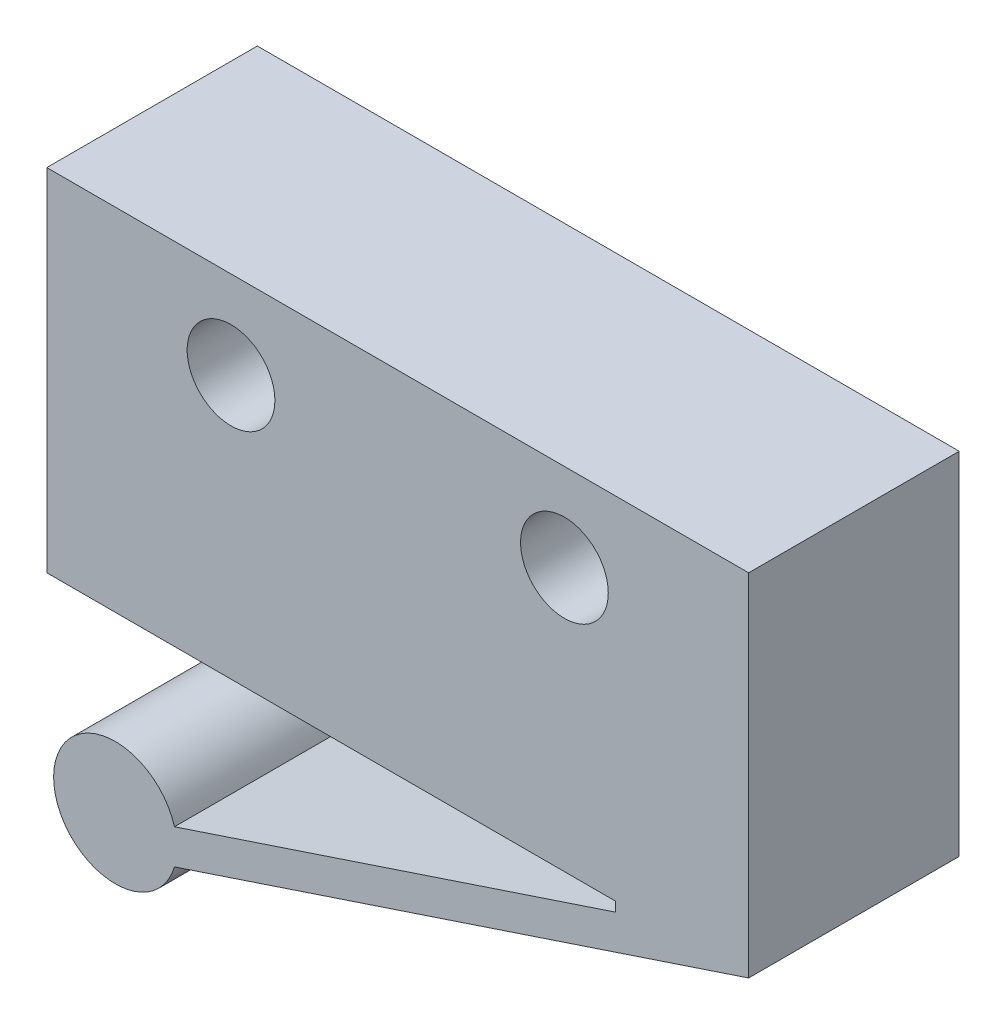
ISO-10303-21;
HEADER;
FILE_DESCRIPTION(('STEP AP214'),'2;1');
FILE_NAME('part.step','',(''),(''),'','','');
FILE_SCHEMA(('AUTOMOTIVE_DESIGN { 1 0 10303 214 1 1 1 1 }'));
ENDSEC;
DATA;
#1=APPLICATION_CONTEXT('core data for automotive mechanical design processes');
#2=APPLICATION_PROTOCOL_DEFINITION('international standard','automotive_design',2000,#1);
#3=PRODUCT_CONTEXT('',#1,'mechanical');
#4=PRODUCT('Part','Part','',(#3));
#5=PRODUCT_RELATED_PRODUCT_CATEGORY('part','',(#4));
#6=PRODUCT_DEFINITION_FORMATION('','',#4);
#7=PRODUCT_DEFINITION_CONTEXT('part definition',#1,'design');
#8=PRODUCT_DEFINITION('design','',#6,#7);
#9=PRODUCT_DEFINITION_SHAPE('','',#8);
#10=(LENGTH_UNIT() NAMED_UNIT(*) SI_UNIT(.MILLI.,.METRE.));
#11=(NAMED_UNIT(*) PLANE_ANGLE_UNIT() SI_UNIT($,.RADIAN.));
#12=(NAMED_UNIT(*) SI_UNIT($,.STERADIAN.) SOLID_ANGLE_UNIT());
#13=UNCERTAINTY_MEASURE_WITH_UNIT(LENGTH_MEASURE(1.E-05),#10,'distance_accuracy_value','');
#14=(GEOMETRIC_REPRESENTATION_CONTEXT(3) GLOBAL_UNCERTAINTY_ASSIGNED_CONTEXT((#13)) GLOBAL_UNIT_ASSIGNED_CONTEXT((#10,
#11,#12)) REPRESENTATION_CONTEXT('',''));
#15=CARTESIAN_POINT('',(0.,0.,0.));
#16=DIRECTION('',(0.,0.,1.));
#17=DIRECTION('',(1.,0.,0.));
#18=AXIS2_PLACEMENT_3D('',#15,#16,#17);
#19=CARTESIAN_POINT('',(-3.29823627136332,-12.4432240988429,6.));
#20=DIRECTION('',(0.,0.,1.));
#21=DIRECTION('',(1.,0.,0.));
#22=AXIS2_PLACEMENT_3D('',#19,#20,#21);
#23=PLANE('',#22);
#24=CARTESIAN_POINT('',(0.,0.,6.));
#25=DIRECTION('',(0.,0.,1.));
#26=DIRECTION('',(1.,0.,0.));
#27=AXIS2_PLACEMENT_3D('',#24,#25,#26);
#28=CIRCLE('',#27,1.25);
#29=CARTESIAN_POINT('',(1.25,0.,6.));
#30=VERTEX_POINT('',#29);
#31=EDGE_CURVE('E146',#30,#30,#28,.T.);
#32=ORIENTED_EDGE('',*,*,#31,.F.);
#33=EDGE_LOOP('',(#32));
#34=FACE_BOUND('',#33,.T.);
#35=DIRECTION('',(0.,1.,0.));
#36=VECTOR('',#35,1.);
#37=CARTESIAN_POINT('',(14.75,2.5,6.));
#38=LINE('',#37,#36);
#39=CARTESIAN_POINT('',(14.75,-7.5,6.));
#40=VERTEX_POINT('',#39);
#41=CARTESIAN_POINT('',(14.75,2.5,6.));
#42=VERTEX_POINT('',#41);
#43=EDGE_CURVE('E164',#40,#42,#38,.T.);
#44=ORIENTED_EDGE('',*,*,#43,.T.);
#45=DIRECTION('',(-1.,0.,0.));
#46=VECTOR('',#45,1.);
#47=CARTESIAN_POINT('',(14.75,2.5,6.));
#48=LINE('',#47,#46);
#49=CARTESIAN_POINT('',(-5.25,2.5,6.));
#50=VERTEX_POINT('',#49);
#51=EDGE_CURVE('E100',#42,#50,#48,.T.);
#52=ORIENTED_EDGE('',*,*,#51,.T.);
#53=DIRECTION('',(0.,-1.,0.));
#54=VECTOR('',#53,1.);
#55=CARTESIAN_POINT('',(-5.25,2.5,6.));
#56=LINE('',#55,#54);
#57=CARTESIAN_POINT('',(-5.24999999999999,-7.5,6.));
#58=VERTEX_POINT('',#57);
#59=EDGE_CURVE('E185',#50,#58,#56,.T.);
#60=ORIENTED_EDGE('',*,*,#59,.T.);
#61=DIRECTION('',(1.,0.,0.));
#62=VECTOR('',#61,1.);
#63=CARTESIAN_POINT('',(-5.24999999999999,-7.5,6.));
#64=LINE('',#63,#62);
#65=CARTESIAN_POINT('',(10.9568461092947,-7.49999999999999,6.));
#66=VERTEX_POINT('',#65);
#67=EDGE_CURVE('E199',#58,#66,#64,.T.);
#68=ORIENTED_EDGE('',*,*,#67,.T.);
#69=DIRECTION('',(0.,-1.,0.));
#70=VECTOR('',#69,1.);
#71=CARTESIAN_POINT('',(10.9568461092947,-7.49999999999999,6.));
#72=LINE('',#71,#70);
#73=CARTESIAN_POINT('',(10.9568461092947,-7.77098260012038,6.));
#74=VERTEX_POINT('',#73);
#75=EDGE_CURVE('E119',#66,#74,#72,.T.);
#76=ORIENTED_EDGE('',*,*,#75,.T.);
#77=DIRECTION('',(-0.948951208735798,-0.315422896186799,0.));
#78=VECTOR('',#77,1.);
#79=CARTESIAN_POINT('',(10.9568461092947,-7.77098260012038,6.));
#80=LINE('',#79,#78);
#81=CARTESIAN_POINT('',(-1.61173482112142,-11.9486665121431,6.));
#82=VERTEX_POINT('',#81);
#83=EDGE_CURVE('E113',#74,#82,#80,.T.);
#84=ORIENTED_EDGE('',*,*,#83,.T.);
#85=CARTESIAN_POINT('',(-3.29823627136332,-12.4432240988429,6.));
#86=DIRECTION('',(0.,0.,1.));
#87=DIRECTION('',(1.,0.,0.));
#88=AXIS2_PLACEMENT_3D('',#85,#86,#87);
#89=CIRCLE('',#88,1.75751937350073);
#90=CARTESIAN_POINT('',(-1.61196659771395,-12.9385713870769,6.));
#91=VERTEX_POINT('',#90);
#92=EDGE_CURVE('E117',#82,#91,#89,.T.);
#93=ORIENTED_EDGE('',*,*,#92,.T.);
#94=DIRECTION('',(0.948951208735798,0.315422896186799,0.));
#95=VECTOR('',#94,1.);
#96=CARTESIAN_POINT('',(-1.61196659771395,-12.9385713870769,6.));
#97=LINE('',#96,#95);
#98=EDGE_CURVE('E57',#91,#40,#97,.T.);
#99=ORIENTED_EDGE('',*,*,#98,.T.);
#100=EDGE_LOOP('',(#44,#52,#60,#68,#76,#84,#93,#99));
#101=FACE_BOUND('',#100,.T.);
#102=CARTESIAN_POINT('',(9.5,0.,6.));
#103=DIRECTION('',(0.,0.,1.));
#104=DIRECTION('',(1.,0.,0.));
#105=AXIS2_PLACEMENT_3D('',#102,#103,#104);
#106=CIRCLE('',#105,1.25);
#107=CARTESIAN_POINT('',(10.75,0.,6.));
#108=VERTEX_POINT('',#107);
#109=EDGE_CURVE('E213',#108,#108,#106,.T.);
#110=ORIENTED_EDGE('',*,*,#109,.F.);
#111=EDGE_LOOP('',(#110));
#112=FACE_BOUND('',#111,.T.);
#113=ADVANCED_FACE('F39',(#34,#101,#112),#23,.T.);
#114=CARTESIAN_POINT('',(-3.29823627136332,-12.4432240988429,0.));
#115=DIRECTION('',(0.,0.,1.));
#116=DIRECTION('',(1.,0.,0.));
#117=AXIS2_PLACEMENT_3D('',#114,#115,#116);
#118=PLANE('',#117);
#119=DIRECTION('',(0.,1.,0.));
#120=VECTOR('',#119,1.);
#121=CARTESIAN_POINT('',(14.75,2.5,0.));
#122=LINE('',#121,#120);
#123=CARTESIAN_POINT('',(14.75,-7.5,0.));
#124=VERTEX_POINT('',#123);
#125=CARTESIAN_POINT('',(14.75,2.5,0.));
#126=VERTEX_POINT('',#125);
#127=EDGE_CURVE('E141',#124,#126,#122,.T.);
#128=ORIENTED_EDGE('',*,*,#127,.F.);
#129=DIRECTION('',(0.948951208735798,0.315422896186799,0.));
#130=VECTOR('',#129,1.);
#131=CARTESIAN_POINT('',(-1.61196659771395,-12.9385713870769,0.));
#132=LINE('',#131,#130);
#133=CARTESIAN_POINT('',(-1.61196659771395,-12.9385713870769,0.));
#134=VERTEX_POINT('',#133);
#135=EDGE_CURVE('E92',#134,#124,#132,.T.);
#136=ORIENTED_EDGE('',*,*,#135,.F.);
#137=CARTESIAN_POINT('',(-3.29823627136332,-12.4432240988429,0.));
#138=DIRECTION('',(0.,0.,1.));
#139=DIRECTION('',(1.,0.,0.));
#140=AXIS2_PLACEMENT_3D('',#137,#138,#139);
#141=CIRCLE('',#140,1.75751937350073);
#142=CARTESIAN_POINT('',(-1.61173482112142,-11.9486665121431,0.));
#143=VERTEX_POINT('',#142);
#144=EDGE_CURVE('E86',#143,#134,#141,.T.);
#145=ORIENTED_EDGE('',*,*,#144,.F.);
#146=DIRECTION('',(-0.948951208735798,-0.315422896186799,0.));
#147=VECTOR('',#146,1.);
#148=CARTESIAN_POINT('',(10.9568461092947,-7.77098260012038,0.));
#149=LINE('',#148,#147);
#150=CARTESIAN_POINT('',(10.9568461092947,-7.77098260012038,0.));
#151=VERTEX_POINT('',#150);
#152=EDGE_CURVE('E128',#151,#143,#149,.T.);
#153=ORIENTED_EDGE('',*,*,#152,.F.);
#154=DIRECTION('',(0.,-1.,0.));
#155=VECTOR('',#154,1.);
#156=CARTESIAN_POINT('',(10.9568461092947,-7.49999999999999,0.));
#157=LINE('',#156,#155);
#158=CARTESIAN_POINT('',(10.9568461092947,-7.49999999999999,0.));
#159=VERTEX_POINT('',#158);
#160=EDGE_CURVE('E155',#159,#151,#157,.T.);
#161=ORIENTED_EDGE('',*,*,#160,.F.);
#162=DIRECTION('',(1.,0.,0.));
#163=VECTOR('',#162,1.);
#164=CARTESIAN_POINT('',(-5.24999999999999,-7.5,0.));
#165=LINE('',#164,#163);
#166=CARTESIAN_POINT('',(-5.24999999999999,-7.5,0.));
#167=VERTEX_POINT('',#166);
#168=EDGE_CURVE('E152',#167,#159,#165,.T.);
#169=ORIENTED_EDGE('',*,*,#168,.F.);
#170=DIRECTION('',(0.,-1.,0.));
#171=VECTOR('',#170,1.);
#172=CARTESIAN_POINT('',(-5.25,2.5,0.));
#173=LINE('',#172,#171);
#174=CARTESIAN_POINT('',(-5.25,2.5,0.));
#175=VERTEX_POINT('',#174);
#176=EDGE_CURVE('E149',#175,#167,#173,.T.);
#177=ORIENTED_EDGE('',*,*,#176,.F.);
#178=DIRECTION('',(-1.,0.,0.));
#179=VECTOR('',#178,1.);
#180=CARTESIAN_POINT('',(14.75,2.5,0.));
#181=LINE('',#180,#179);
#182=EDGE_CURVE('E145',#126,#175,#181,.T.);
#183=ORIENTED_EDGE('',*,*,#182,.F.);
#184=EDGE_LOOP('',(#128,#136,#145,#153,#161,#169,#177,#183));
#185=FACE_BOUND('',#184,.T.);
#186=CARTESIAN_POINT('',(0.,0.,0.));
#187=DIRECTION('',(0.,0.,1.));
#188=DIRECTION('',(1.,0.,0.));
#189=AXIS2_PLACEMENT_3D('',#186,#187,#188);
#190=CIRCLE('',#189,1.25);
#191=CARTESIAN_POINT('',(1.25,0.,0.));
#192=VERTEX_POINT('',#191);
#193=EDGE_CURVE('E209',#192,#192,#190,.T.);
#194=ORIENTED_EDGE('',*,*,#193,.T.);
#195=EDGE_LOOP('',(#194));
#196=FACE_BOUND('',#195,.T.);
#197=CARTESIAN_POINT('',(9.5,0.,0.));
#198=DIRECTION('',(0.,0.,1.));
#199=DIRECTION('',(1.,0.,0.));
#200=AXIS2_PLACEMENT_3D('',#197,#198,#199);
#201=CIRCLE('',#200,1.25);
#202=CARTESIAN_POINT('',(10.75,0.,0.));
#203=VERTEX_POINT('',#202);
#204=EDGE_CURVE('E217',#203,#203,#201,.T.);
#205=ORIENTED_EDGE('',*,*,#204,.T.);
#206=EDGE_LOOP('',(#205));
#207=FACE_BOUND('',#206,.T.);
#208=ADVANCED_FACE('F189',(#185,#196,#207),#118,.F.);
#209=CARTESIAN_POINT('',(14.75,2.5,6.));
#210=DIRECTION('',(-1.,0.,0.));
#211=DIRECTION('',(0.,0.,1.));
#212=AXIS2_PLACEMENT_3D('',#209,#210,#211);
#213=PLANE('',#212);
#214=ORIENTED_EDGE('',*,*,#127,.T.);
#215=DIRECTION('',(0.,0.,-1.));
#216=VECTOR('',#215,1.);
#217=CARTESIAN_POINT('',(14.75,2.5,6.));
#218=LINE('',#217,#216);
#219=EDGE_CURVE('E11',#42,#126,#218,.T.);
#220=ORIENTED_EDGE('',*,*,#219,.F.);
#221=ORIENTED_EDGE('',*,*,#43,.F.);
#222=DIRECTION('',(0.,0.,-1.));
#223=VECTOR('',#222,1.);
#224=CARTESIAN_POINT('',(14.75,-7.5,6.));
#225=LINE('',#224,#223);
#226=EDGE_CURVE('E137',#40,#124,#225,.T.);
#227=ORIENTED_EDGE('',*,*,#226,.T.);
#228=EDGE_LOOP('',(#214,#220,#221,#227));
#229=FACE_BOUND('',#228,.T.);
#230=ADVANCED_FACE('F41',(#229),#213,.F.);
#231=CARTESIAN_POINT('',(14.75,2.5,6.));
#232=DIRECTION('',(0.,-1.,0.));
#233=DIRECTION('',(0.,0.,-1.));
#234=AXIS2_PLACEMENT_3D('',#231,#232,#233);
#235=PLANE('',#234);
#236=ORIENTED_EDGE('',*,*,#182,.T.);
#237=DIRECTION('',(0.,0.,-1.));
#238=VECTOR('',#237,1.);
#239=CARTESIAN_POINT('',(-5.25,2.5,6.));
#240=LINE('',#239,#238);
#241=EDGE_CURVE('E49',#50,#175,#240,.T.);
#242=ORIENTED_EDGE('',*,*,#241,.F.);
#243=ORIENTED_EDGE('',*,*,#51,.F.);
#244=ORIENTED_EDGE('',*,*,#219,.T.);
#245=EDGE_LOOP('',(#236,#242,#243,#244));
#246=FACE_BOUND('',#245,.T.);
#247=ADVANCED_FACE('F251',(#246),#235,.F.);
#248=CARTESIAN_POINT('',(-5.25,2.5,6.));
#249=DIRECTION('',(1.,0.,0.));
#250=DIRECTION('',(0.,1.,0.));
#251=AXIS2_PLACEMENT_3D('',#248,#249,#250);
#252=PLANE('',#251);
#253=ORIENTED_EDGE('',*,*,#176,.T.);
#254=DIRECTION('',(0.,0.,-1.));
#255=VECTOR('',#254,1.);
#256=CARTESIAN_POINT('',(-5.24999999999999,-7.5,6.));
#257=LINE('',#256,#255);
#258=EDGE_CURVE('E175',#58,#167,#257,.T.);
#259=ORIENTED_EDGE('',*,*,#258,.F.);
#260=ORIENTED_EDGE('',*,*,#59,.F.);
#261=ORIENTED_EDGE('',*,*,#241,.T.);
#262=EDGE_LOOP('',(#253,#259,#260,#261));
#263=FACE_BOUND('',#262,.T.);
#264=ADVANCED_FACE('F183',(#263),#252,.F.);
#265=CARTESIAN_POINT('',(-5.24999999999999,-7.5,6.));
#266=DIRECTION('',(0.,1.,0.));
#267=DIRECTION('',(-1.,0.,0.));
#268=AXIS2_PLACEMENT_3D('',#265,#266,#267);
#269=PLANE('',#268);
#270=ORIENTED_EDGE('',*,*,#168,.T.);
#271=DIRECTION('',(0.,0.,-1.));
#272=VECTOR('',#271,1.);
#273=CARTESIAN_POINT('',(10.9568461092947,-7.49999999999999,6.));
#274=LINE('',#273,#272);
#275=EDGE_CURVE('E171',#66,#159,#274,.T.);
#276=ORIENTED_EDGE('',*,*,#275,.F.);
#277=ORIENTED_EDGE('',*,*,#67,.F.);
#278=ORIENTED_EDGE('',*,*,#258,.T.);
#279=EDGE_LOOP('',(#270,#276,#277,#278));
#280=FACE_BOUND('',#279,.T.);
#281=ADVANCED_FACE('F194',(#280),#269,.F.);
#282=CARTESIAN_POINT('',(10.9568461092947,-7.49999999999999,6.));
#283=DIRECTION('',(1.,0.,0.));
#284=DIRECTION('',(0.,0.,-1.));
#285=AXIS2_PLACEMENT_3D('',#282,#283,#284);
#286=PLANE('',#285);
#287=ORIENTED_EDGE('',*,*,#160,.T.);
#288=DIRECTION('',(0.,0.,-1.));
#289=VECTOR('',#288,1.);
#290=CARTESIAN_POINT('',(10.9568461092947,-7.77098260012038,6.));
#291=LINE('',#290,#289);
#292=EDGE_CURVE('E130',#74,#151,#291,.T.);
#293=ORIENTED_EDGE('',*,*,#292,.F.);
#294=ORIENTED_EDGE('',*,*,#75,.F.);
#295=ORIENTED_EDGE('',*,*,#275,.T.);
#296=EDGE_LOOP('',(#287,#293,#294,#295));
#297=FACE_BOUND('',#296,.T.);
#298=ADVANCED_FACE('F197',(#297),#286,.F.);
#299=CARTESIAN_POINT('',(10.9568461092947,-7.77098260012038,6.));
#300=DIRECTION('',(0.315422896186799,-0.948951208735798,0.));
#301=DIRECTION('',(0.948951208735798,0.315422896186799,0.));
#302=AXIS2_PLACEMENT_3D('',#299,#300,#301);
#303=PLANE('',#302);
#304=ORIENTED_EDGE('',*,*,#152,.T.);
#305=DIRECTION('',(0.,0.,-1.));
#306=VECTOR('',#305,1.);
#307=CARTESIAN_POINT('',(-1.61173482112142,-11.9486665121431,6.));
#308=LINE('',#307,#306);
#309=EDGE_CURVE('E125',#82,#143,#308,.T.);
#310=ORIENTED_EDGE('',*,*,#309,.F.);
#311=ORIENTED_EDGE('',*,*,#83,.F.);
#312=ORIENTED_EDGE('',*,*,#292,.T.);
#313=EDGE_LOOP('',(#304,#310,#311,#312));
#314=FACE_BOUND('',#313,.T.);
#315=ADVANCED_FACE('F126',(#314),#303,.F.);
#316=CARTESIAN_POINT('',(-3.29823627136332,-12.4432240988429,6.));
#317=DIRECTION('',(0.,0.,-1.));
#318=DIRECTION('',(-1.,0.,0.));
#319=AXIS2_PLACEMENT_3D('',#316,#317,#318);
#320=CYLINDRICAL_SURFACE('',#319,1.75751937350073);
#321=ORIENTED_EDGE('',*,*,#144,.T.);
#322=DIRECTION('',(0.,0.,-1.));
#323=VECTOR('',#322,1.);
#324=CARTESIAN_POINT('',(-1.61196659771395,-12.9385713870769,6.));
#325=LINE('',#324,#323);
#326=EDGE_CURVE('E131',#91,#134,#325,.T.);
#327=ORIENTED_EDGE('',*,*,#326,.F.);
#328=ORIENTED_EDGE('',*,*,#92,.F.);
#329=ORIENTED_EDGE('',*,*,#309,.T.);
#330=EDGE_LOOP('',(#321,#327,#328,#329));
#331=FACE_BOUND('',#330,.T.);
#332=ADVANCED_FACE('F133',(#331),#320,.T.);
#333=CARTESIAN_POINT('',(-1.61196659771395,-12.9385713870769,6.));
#334=DIRECTION('',(-0.315422896186799,0.948951208735798,0.));
#335=DIRECTION('',(-0.948951208735798,-0.315422896186799,0.));
#336=AXIS2_PLACEMENT_3D('',#333,#334,#335);
#337=PLANE('',#336);
#338=ORIENTED_EDGE('',*,*,#135,.T.);
#339=ORIENTED_EDGE('',*,*,#226,.F.);
#340=ORIENTED_EDGE('',*,*,#98,.F.);
#341=ORIENTED_EDGE('',*,*,#326,.T.);
#342=EDGE_LOOP('',(#338,#339,#340,#341));
#343=FACE_BOUND('',#342,.T.);
#344=ADVANCED_FACE('F239',(#343),#337,.F.);
#345=CARTESIAN_POINT('',(0.,0.,6.));
#346=DIRECTION('',(0.,0.,-1.));
#347=DIRECTION('',(-1.,0.,0.));
#348=AXIS2_PLACEMENT_3D('',#345,#346,#347);
#349=CYLINDRICAL_SURFACE('',#348,1.25);
#350=ORIENTED_EDGE('',*,*,#31,.T.);
#351=EDGE_LOOP('',(#350));
#352=FACE_BOUND('',#351,.T.);
#353=ORIENTED_EDGE('',*,*,#193,.F.);
#354=EDGE_LOOP('',(#353));
#355=FACE_BOUND('',#354,.T.);
#356=ADVANCED_FACE('F236',(#352,#355),#349,.F.);
#357=CARTESIAN_POINT('',(9.5,0.,6.));
#358=DIRECTION('',(0.,0.,-1.));
#359=DIRECTION('',(-1.,0.,0.));
#360=AXIS2_PLACEMENT_3D('',#357,#358,#359);
#361=CYLINDRICAL_SURFACE('',#360,1.25);
#362=ORIENTED_EDGE('',*,*,#109,.T.);
#363=EDGE_LOOP('',(#362));
#364=FACE_BOUND('',#363,.T.);
#365=ORIENTED_EDGE('',*,*,#204,.F.);
#366=EDGE_LOOP('',(#365));
#367=FACE_BOUND('',#366,.T.);
#368=ADVANCED_FACE('F225',(#364,#367),#361,.F.);
#369=CLOSED_SHELL('',(#113,#208,#230,#247,#264,#281,#298,#315,#332,#344,#356,#368));
#370=MANIFOLD_SOLID_BREP('B2',#369);
#371=ADVANCED_BREP_SHAPE_REPRESENTATION('',(#18,#370),#14);
#372=SHAPE_DEFINITION_REPRESENTATION(#9,#371);
ENDSEC;
END-ISO-10303-21;
